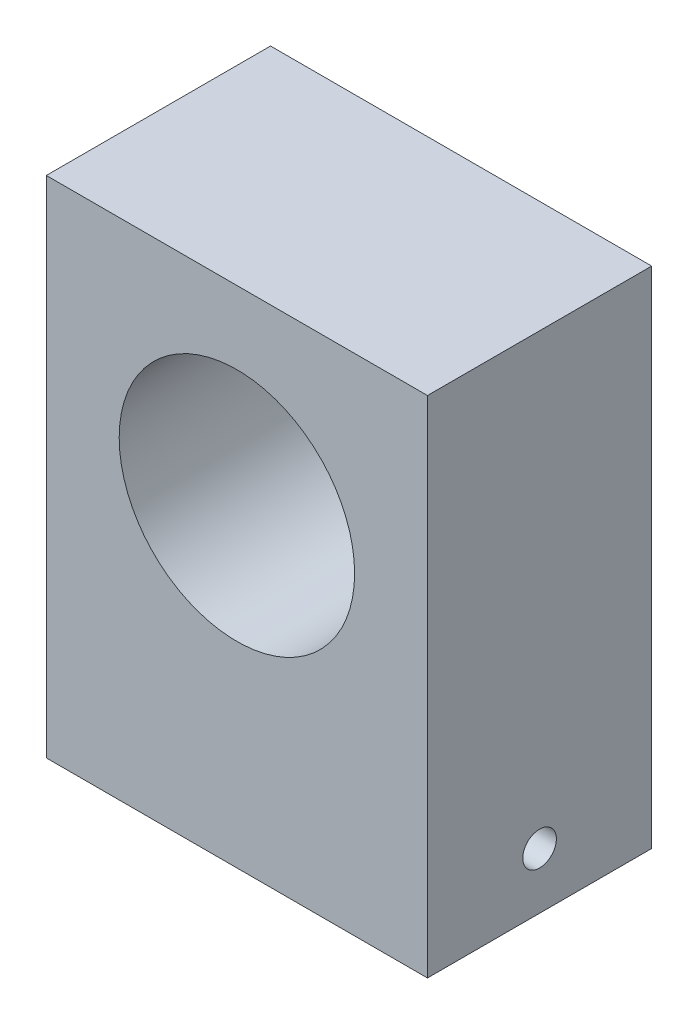
ISO-10303-21;
HEADER;
FILE_DESCRIPTION(('STEP AP214'),'2;1');
FILE_NAME('part.step','',(''),(''),'','','');
FILE_SCHEMA(('AUTOMOTIVE_DESIGN { 1 0 10303 214 1 1 1 1 }'));
ENDSEC;
DATA;
#1=APPLICATION_CONTEXT('core data for automotive mechanical design processes');
#2=APPLICATION_PROTOCOL_DEFINITION('international standard','automotive_design',2000,#1);
#3=PRODUCT_CONTEXT('',#1,'mechanical');
#4=PRODUCT('Part','Part','',(#3));
#5=PRODUCT_RELATED_PRODUCT_CATEGORY('part','',(#4));
#6=PRODUCT_DEFINITION_FORMATION('','',#4);
#7=PRODUCT_DEFINITION_CONTEXT('part definition',#1,'design');
#8=PRODUCT_DEFINITION('design','',#6,#7);
#9=PRODUCT_DEFINITION_SHAPE('','',#8);
#10=(LENGTH_UNIT() NAMED_UNIT(*) SI_UNIT(.MILLI.,.METRE.));
#11=(NAMED_UNIT(*) PLANE_ANGLE_UNIT() SI_UNIT($,.RADIAN.));
#12=(NAMED_UNIT(*) SI_UNIT($,.STERADIAN.) SOLID_ANGLE_UNIT());
#13=UNCERTAINTY_MEASURE_WITH_UNIT(LENGTH_MEASURE(1.E-05),#10,'distance_accuracy_value','');
#14=(GEOMETRIC_REPRESENTATION_CONTEXT(3) GLOBAL_UNCERTAINTY_ASSIGNED_CONTEXT((#13)) GLOBAL_UNIT_ASSIGNED_CONTEXT((#10,
#11,#12)) REPRESENTATION_CONTEXT('',''));
#15=CARTESIAN_POINT('',(0.,0.,0.));
#16=DIRECTION('',(0.,0.,1.));
#17=DIRECTION('',(1.,0.,0.));
#18=AXIS2_PLACEMENT_3D('',#15,#16,#17);
#19=CARTESIAN_POINT('',(0.,0.,-20.));
#20=DIRECTION('',(-1.,0.,0.));
#21=DIRECTION('',(0.,-1.,0.));
#22=AXIS2_PLACEMENT_3D('',#19,#20,#21);
#23=PLANE('',#22);
#24=CARTESIAN_POINT('',(0.,5.,-10.));
#25=DIRECTION('',(1.,0.,0.));
#26=DIRECTION('',(0.,1.,0.));
#27=AXIS2_PLACEMENT_3D('',#24,#25,#26);
#28=CIRCLE('',#27,1.5);
#29=CARTESIAN_POINT('',(0.,6.5,-10.));
#30=VERTEX_POINT('',#29);
#31=EDGE_CURVE('E195',#30,#30,#28,.T.);
#32=ORIENTED_EDGE('',*,*,#31,.T.);
#33=EDGE_LOOP('',(#32));
#34=FACE_BOUND('',#33,.T.);
#35=DIRECTION('',(0.,-1.,0.));
#36=VECTOR('',#35,1.);
#37=CARTESIAN_POINT('',(0.,0.,0.));
#38=LINE('',#37,#36);
#39=CARTESIAN_POINT('',(0.,45.,0.));
#40=VERTEX_POINT('',#39);
#41=CARTESIAN_POINT('',(0.,0.,0.));
#42=VERTEX_POINT('',#41);
#43=EDGE_CURVE('E134',#40,#42,#38,.T.);
#44=ORIENTED_EDGE('',*,*,#43,.F.);
#45=DIRECTION('',(0.,0.,1.));
#46=VECTOR('',#45,1.);
#47=CARTESIAN_POINT('',(0.,45.,-20.));
#48=LINE('',#47,#46);
#49=CARTESIAN_POINT('',(0.,45.,-20.));
#50=VERTEX_POINT('',#49);
#51=EDGE_CURVE('E11',#50,#40,#48,.T.);
#52=ORIENTED_EDGE('',*,*,#51,.F.);
#53=DIRECTION('',(0.,-1.,0.));
#54=VECTOR('',#53,1.);
#55=CARTESIAN_POINT('',(0.,0.,-20.));
#56=LINE('',#55,#54);
#57=CARTESIAN_POINT('',(0.,0.,-20.));
#58=VERTEX_POINT('',#57);
#59=EDGE_CURVE('E139',#50,#58,#56,.T.);
#60=ORIENTED_EDGE('',*,*,#59,.T.);
#61=DIRECTION('',(0.,0.,1.));
#62=VECTOR('',#61,1.);
#63=CARTESIAN_POINT('',(0.,0.,-20.));
#64=LINE('',#63,#62);
#65=EDGE_CURVE('E82',#58,#42,#64,.T.);
#66=ORIENTED_EDGE('',*,*,#65,.T.);
#67=EDGE_LOOP('',(#44,#52,#60,#66));
#68=FACE_BOUND('',#67,.T.);
#69=ADVANCED_FACE('F33',(#34,#68),#23,.T.);
#70=CARTESIAN_POINT('',(0.,45.,-20.));
#71=DIRECTION('',(0.,1.,0.));
#72=DIRECTION('',(0.,0.,1.));
#73=AXIS2_PLACEMENT_3D('',#70,#71,#72);
#74=PLANE('',#73);
#75=DIRECTION('',(-1.,0.,0.));
#76=VECTOR('',#75,1.);
#77=CARTESIAN_POINT('',(0.,45.,0.));
#78=LINE('',#77,#76);
#79=CARTESIAN_POINT('',(34.,45.,0.));
#80=VERTEX_POINT('',#79);
#81=EDGE_CURVE('E142',#80,#40,#78,.T.);
#82=ORIENTED_EDGE('',*,*,#81,.F.);
#83=DIRECTION('',(0.,0.,1.));
#84=VECTOR('',#83,1.);
#85=CARTESIAN_POINT('',(34.,45.,-20.));
#86=LINE('',#85,#84);
#87=CARTESIAN_POINT('',(34.,45.,-20.));
#88=VERTEX_POINT('',#87);
#89=EDGE_CURVE('E41',#88,#80,#86,.T.);
#90=ORIENTED_EDGE('',*,*,#89,.F.);
#91=DIRECTION('',(-1.,0.,0.));
#92=VECTOR('',#91,1.);
#93=CARTESIAN_POINT('',(0.,45.,-20.));
#94=LINE('',#93,#92);
#95=EDGE_CURVE('E147',#88,#50,#94,.T.);
#96=ORIENTED_EDGE('',*,*,#95,.T.);
#97=ORIENTED_EDGE('',*,*,#51,.T.);
#98=EDGE_LOOP('',(#82,#90,#96,#97));
#99=FACE_BOUND('',#98,.T.);
#100=ADVANCED_FACE('F165',(#99),#74,.T.);
#101=CARTESIAN_POINT('',(34.,0.,-20.));
#102=DIRECTION('',(1.,0.,0.));
#103=DIRECTION('',(0.,1.,0.));
#104=AXIS2_PLACEMENT_3D('',#101,#102,#103);
#105=PLANE('',#104);
#106=CARTESIAN_POINT('',(34.,5.,-10.));
#107=DIRECTION('',(1.,0.,0.));
#108=DIRECTION('',(0.,1.,0.));
#109=AXIS2_PLACEMENT_3D('',#106,#107,#108);
#110=CIRCLE('',#109,1.5);
#111=CARTESIAN_POINT('',(34.,6.5,-10.));
#112=VERTEX_POINT('',#111);
#113=EDGE_CURVE('E192',#112,#112,#110,.T.);
#114=ORIENTED_EDGE('',*,*,#113,.F.);
#115=EDGE_LOOP('',(#114));
#116=FACE_BOUND('',#115,.T.);
#117=DIRECTION('',(0.,1.,0.));
#118=VECTOR('',#117,1.);
#119=CARTESIAN_POINT('',(34.,0.,0.));
#120=LINE('',#119,#118);
#121=CARTESIAN_POINT('',(34.,0.,0.));
#122=VERTEX_POINT('',#121);
#123=EDGE_CURVE('E154',#122,#80,#120,.T.);
#124=ORIENTED_EDGE('',*,*,#123,.F.);
#125=DIRECTION('',(0.,0.,1.));
#126=VECTOR('',#125,1.);
#127=CARTESIAN_POINT('',(34.,0.,-20.));
#128=LINE('',#127,#126);
#129=CARTESIAN_POINT('',(34.,0.,-20.));
#130=VERTEX_POINT('',#129);
#131=EDGE_CURVE('E160',#130,#122,#128,.T.);
#132=ORIENTED_EDGE('',*,*,#131,.F.);
#133=DIRECTION('',(0.,1.,0.));
#134=VECTOR('',#133,1.);
#135=CARTESIAN_POINT('',(34.,0.,-20.));
#136=LINE('',#135,#134);
#137=EDGE_CURVE('E144',#130,#88,#136,.T.);
#138=ORIENTED_EDGE('',*,*,#137,.T.);
#139=ORIENTED_EDGE('',*,*,#89,.T.);
#140=EDGE_LOOP('',(#124,#132,#138,#139));
#141=FACE_BOUND('',#140,.T.);
#142=ADVANCED_FACE('F169',(#116,#141),#105,.T.);
#143=CARTESIAN_POINT('',(0.,0.,-20.));
#144=DIRECTION('',(0.,-1.,0.));
#145=DIRECTION('',(0.,0.,-1.));
#146=AXIS2_PLACEMENT_3D('',#143,#144,#145);
#147=PLANE('',#146);
#148=DIRECTION('',(0.,0.,-1.));
#149=VECTOR('',#148,1.);
#150=CARTESIAN_POINT('',(24.65,0.,-6.));
#151=LINE('',#150,#149);
#152=CARTESIAN_POINT('',(24.65,0.,-6.));
#153=VERTEX_POINT('',#152);
#154=CARTESIAN_POINT('',(24.65,0.,-20.));
#155=VERTEX_POINT('',#154);
#156=EDGE_CURVE('E138',#153,#155,#151,.T.);
#157=ORIENTED_EDGE('',*,*,#156,.T.);
#158=DIRECTION('',(1.,0.,0.));
#159=VECTOR('',#158,1.);
#160=CARTESIAN_POINT('',(0.,0.,-20.));
#161=LINE('',#160,#159);
#162=EDGE_CURVE('E141',#155,#130,#161,.T.);
#163=ORIENTED_EDGE('',*,*,#162,.T.);
#164=ORIENTED_EDGE('',*,*,#131,.T.);
#165=DIRECTION('',(1.,0.,0.));
#166=VECTOR('',#165,1.);
#167=CARTESIAN_POINT('',(0.,0.,0.));
#168=LINE('',#167,#166);
#169=EDGE_CURVE('E151',#42,#122,#168,.T.);
#170=ORIENTED_EDGE('',*,*,#169,.F.);
#171=ORIENTED_EDGE('',*,*,#65,.F.);
#172=CARTESIAN_POINT('',(9.35,0.,-20.));
#173=VERTEX_POINT('',#172);
#174=EDGE_CURVE('E124',#58,#173,#161,.T.);
#175=ORIENTED_EDGE('',*,*,#174,.T.);
#176=DIRECTION('',(0.,0.,-1.));
#177=VECTOR('',#176,1.);
#178=CARTESIAN_POINT('',(9.35,0.,-6.));
#179=LINE('',#178,#177);
#180=CARTESIAN_POINT('',(9.35,0.,-6.));
#181=VERTEX_POINT('',#180);
#182=EDGE_CURVE('E49',#181,#173,#179,.T.);
#183=ORIENTED_EDGE('',*,*,#182,.F.);
#184=DIRECTION('',(-1.,0.,0.));
#185=VECTOR('',#184,1.);
#186=CARTESIAN_POINT('',(24.65,0.,-6.));
#187=LINE('',#186,#185);
#188=EDGE_CURVE('E113',#153,#181,#187,.T.);
#189=ORIENTED_EDGE('',*,*,#188,.F.);
#190=EDGE_LOOP('',(#157,#163,#164,#170,#171,#175,#183,#189));
#191=FACE_BOUND('',#190,.T.);
#192=ADVANCED_FACE('F123',(#191),#147,.T.);
#193=CARTESIAN_POINT('',(0.,0.,-20.));
#194=DIRECTION('',(0.,0.,-1.));
#195=DIRECTION('',(-1.,0.,0.));
#196=AXIS2_PLACEMENT_3D('',#193,#194,#195);
#197=PLANE('',#196);
#198=DIRECTION('',(0.,-1.,0.));
#199=VECTOR('',#198,1.);
#200=CARTESIAN_POINT('',(24.65,12.,-20.));
#201=LINE('',#200,#199);
#202=CARTESIAN_POINT('',(24.65,12.,-20.));
#203=VERTEX_POINT('',#202);
#204=EDGE_CURVE('E121',#203,#155,#201,.T.);
#205=ORIENTED_EDGE('',*,*,#204,.F.);
#206=DIRECTION('',(-1.,0.,0.));
#207=VECTOR('',#206,1.);
#208=CARTESIAN_POINT('',(24.65,12.,-20.));
#209=LINE('',#208,#207);
#210=CARTESIAN_POINT('',(9.35,12.,-20.));
#211=VERTEX_POINT('',#210);
#212=EDGE_CURVE('E178',#203,#211,#209,.T.);
#213=ORIENTED_EDGE('',*,*,#212,.T.);
#214=DIRECTION('',(0.,-1.,0.));
#215=VECTOR('',#214,1.);
#216=CARTESIAN_POINT('',(9.35,12.,-20.));
#217=LINE('',#216,#215);
#218=EDGE_CURVE('E176',#211,#173,#217,.T.);
#219=ORIENTED_EDGE('',*,*,#218,.T.);
#220=ORIENTED_EDGE('',*,*,#174,.F.);
#221=ORIENTED_EDGE('',*,*,#59,.F.);
#222=ORIENTED_EDGE('',*,*,#95,.F.);
#223=ORIENTED_EDGE('',*,*,#137,.F.);
#224=ORIENTED_EDGE('',*,*,#162,.F.);
#225=EDGE_LOOP('',(#205,#213,#219,#220,#221,#222,#223,#224));
#226=FACE_BOUND('',#225,.T.);
#227=CARTESIAN_POINT('',(17.,28.,-20.));
#228=DIRECTION('',(0.,0.,1.));
#229=DIRECTION('',(1.,0.,0.));
#230=AXIS2_PLACEMENT_3D('',#227,#228,#229);
#231=CIRCLE('',#230,10.5);
#232=CARTESIAN_POINT('',(27.5,28.,-20.));
#233=VERTEX_POINT('',#232);
#234=EDGE_CURVE('E131',#233,#233,#231,.T.);
#235=ORIENTED_EDGE('',*,*,#234,.T.);
#236=EDGE_LOOP('',(#235));
#237=FACE_BOUND('',#236,.T.);
#238=ADVANCED_FACE('F173',(#226,#237),#197,.T.);
#239=CARTESIAN_POINT('',(0.,0.,0.));
#240=DIRECTION('',(0.,0.,-1.));
#241=DIRECTION('',(-1.,0.,0.));
#242=AXIS2_PLACEMENT_3D('',#239,#240,#241);
#243=PLANE('',#242);
#244=CARTESIAN_POINT('',(17.,28.,0.));
#245=DIRECTION('',(0.,0.,1.));
#246=DIRECTION('',(1.,0.,0.));
#247=AXIS2_PLACEMENT_3D('',#244,#245,#246);
#248=CIRCLE('',#247,10.5);
#249=CARTESIAN_POINT('',(27.5,28.,0.));
#250=VERTEX_POINT('',#249);
#251=EDGE_CURVE('E135',#250,#250,#248,.T.);
#252=ORIENTED_EDGE('',*,*,#251,.F.);
#253=EDGE_LOOP('',(#252));
#254=FACE_BOUND('',#253,.T.);
#255=ORIENTED_EDGE('',*,*,#43,.T.);
#256=ORIENTED_EDGE('',*,*,#169,.T.);
#257=ORIENTED_EDGE('',*,*,#123,.T.);
#258=ORIENTED_EDGE('',*,*,#81,.T.);
#259=EDGE_LOOP('',(#255,#256,#257,#258));
#260=FACE_BOUND('',#259,.T.);
#261=ADVANCED_FACE('F164',(#254,#260),#243,.F.);
#262=CARTESIAN_POINT('',(17.,28.,-20.));
#263=DIRECTION('',(0.,0.,1.));
#264=DIRECTION('',(1.,0.,0.));
#265=AXIS2_PLACEMENT_3D('',#262,#263,#264);
#266=CYLINDRICAL_SURFACE('',#265,10.5);
#267=ORIENTED_EDGE('',*,*,#234,.F.);
#268=EDGE_LOOP('',(#267));
#269=FACE_BOUND('',#268,.T.);
#270=ORIENTED_EDGE('',*,*,#251,.T.);
#271=EDGE_LOOP('',(#270));
#272=FACE_BOUND('',#271,.T.);
#273=ADVANCED_FACE('F233',(#269,#272),#266,.F.);
#274=CARTESIAN_POINT('',(24.65,12.,-6.));
#275=DIRECTION('',(1.,0.,0.));
#276=DIRECTION('',(0.,0.,-1.));
#277=AXIS2_PLACEMENT_3D('',#274,#275,#276);
#278=PLANE('',#277);
#279=CARTESIAN_POINT('',(24.65,5.,-10.));
#280=DIRECTION('',(1.,0.,0.));
#281=DIRECTION('',(0.,0.,-1.));
#282=AXIS2_PLACEMENT_3D('',#279,#280,#281);
#283=CIRCLE('',#282,1.5);
#284=CARTESIAN_POINT('',(24.65,5.,-11.5));
#285=VERTEX_POINT('',#284);
#286=EDGE_CURVE('E179',#285,#285,#283,.T.);
#287=ORIENTED_EDGE('',*,*,#286,.T.);
#288=EDGE_LOOP('',(#287));
#289=FACE_BOUND('',#288,.T.);
#290=ORIENTED_EDGE('',*,*,#204,.T.);
#291=ORIENTED_EDGE('',*,*,#156,.F.);
#292=DIRECTION('',(0.,-1.,0.));
#293=VECTOR('',#292,1.);
#294=CARTESIAN_POINT('',(24.65,12.,-6.));
#295=LINE('',#294,#293);
#296=CARTESIAN_POINT('',(24.65,12.,-6.));
#297=VERTEX_POINT('',#296);
#298=EDGE_CURVE('E119',#297,#153,#295,.T.);
#299=ORIENTED_EDGE('',*,*,#298,.F.);
#300=DIRECTION('',(0.,0.,-1.));
#301=VECTOR('',#300,1.);
#302=CARTESIAN_POINT('',(24.65,12.,-6.));
#303=LINE('',#302,#301);
#304=EDGE_CURVE('E126',#297,#203,#303,.T.);
#305=ORIENTED_EDGE('',*,*,#304,.T.);
#306=EDGE_LOOP('',(#290,#291,#299,#305));
#307=FACE_BOUND('',#306,.T.);
#308=ADVANCED_FACE('F188',(#289,#307),#278,.F.);
#309=CARTESIAN_POINT('',(24.65,12.,-6.));
#310=DIRECTION('',(0.,-1.,0.));
#311=DIRECTION('',(0.,0.,-1.));
#312=AXIS2_PLACEMENT_3D('',#309,#310,#311);
#313=PLANE('',#312);
#314=ORIENTED_EDGE('',*,*,#212,.F.);
#315=ORIENTED_EDGE('',*,*,#304,.F.);
#316=DIRECTION('',(-1.,0.,0.));
#317=VECTOR('',#316,1.);
#318=CARTESIAN_POINT('',(24.65,12.,-6.));
#319=LINE('',#318,#317);
#320=CARTESIAN_POINT('',(9.35,12.,-6.));
#321=VERTEX_POINT('',#320);
#322=EDGE_CURVE('E112',#297,#321,#319,.T.);
#323=ORIENTED_EDGE('',*,*,#322,.T.);
#324=DIRECTION('',(0.,0.,-1.));
#325=VECTOR('',#324,1.);
#326=CARTESIAN_POINT('',(9.35,12.,-6.));
#327=LINE('',#326,#325);
#328=EDGE_CURVE('E109',#321,#211,#327,.T.);
#329=ORIENTED_EDGE('',*,*,#328,.T.);
#330=EDGE_LOOP('',(#314,#315,#323,#329));
#331=FACE_BOUND('',#330,.T.);
#332=ADVANCED_FACE('F190',(#331),#313,.T.);
#333=CARTESIAN_POINT('',(9.35,12.,-6.));
#334=DIRECTION('',(1.,0.,0.));
#335=DIRECTION('',(0.,1.,0.));
#336=AXIS2_PLACEMENT_3D('',#333,#334,#335);
#337=PLANE('',#336);
#338=CARTESIAN_POINT('',(9.35,5.,-10.));
#339=DIRECTION('',(1.,0.,0.));
#340=DIRECTION('',(0.,1.,0.));
#341=AXIS2_PLACEMENT_3D('',#338,#339,#340);
#342=CIRCLE('',#341,1.5);
#343=CARTESIAN_POINT('',(9.35,6.5,-10.));
#344=VERTEX_POINT('',#343);
#345=EDGE_CURVE('E36',#344,#344,#342,.T.);
#346=ORIENTED_EDGE('',*,*,#345,.F.);
#347=EDGE_LOOP('',(#346));
#348=FACE_BOUND('',#347,.T.);
#349=ORIENTED_EDGE('',*,*,#218,.F.);
#350=ORIENTED_EDGE('',*,*,#328,.F.);
#351=DIRECTION('',(0.,-1.,0.));
#352=VECTOR('',#351,1.);
#353=CARTESIAN_POINT('',(9.35,12.,-6.));
#354=LINE('',#353,#352);
#355=EDGE_CURVE('E106',#321,#181,#354,.T.);
#356=ORIENTED_EDGE('',*,*,#355,.T.);
#357=ORIENTED_EDGE('',*,*,#182,.T.);
#358=EDGE_LOOP('',(#349,#350,#356,#357));
#359=FACE_BOUND('',#358,.T.);
#360=ADVANCED_FACE('F108',(#348,#359),#337,.T.);
#361=CARTESIAN_POINT('',(0.,0.,-6.));
#362=DIRECTION('',(0.,0.,1.));
#363=DIRECTION('',(1.,0.,0.));
#364=AXIS2_PLACEMENT_3D('',#361,#362,#363);
#365=PLANE('',#364);
#366=ORIENTED_EDGE('',*,*,#188,.T.);
#367=ORIENTED_EDGE('',*,*,#355,.F.);
#368=ORIENTED_EDGE('',*,*,#322,.F.);
#369=ORIENTED_EDGE('',*,*,#298,.T.);
#370=EDGE_LOOP('',(#366,#367,#368,#369));
#371=FACE_BOUND('',#370,.T.);
#372=ADVANCED_FACE('F117',(#371),#365,.F.);
#373=CARTESIAN_POINT('',(0.,5.,-10.));
#374=DIRECTION('',(1.,0.,0.));
#375=DIRECTION('',(0.,1.,0.));
#376=AXIS2_PLACEMENT_3D('',#373,#374,#375);
#377=CYLINDRICAL_SURFACE('',#376,1.5);
#378=ORIENTED_EDGE('',*,*,#345,.T.);
#379=EDGE_LOOP('',(#378));
#380=FACE_BOUND('',#379,.T.);
#381=ORIENTED_EDGE('',*,*,#31,.F.);
#382=EDGE_LOOP('',(#381));
#383=FACE_BOUND('',#382,.T.);
#384=ADVANCED_FACE('F202',(#380,#383),#377,.F.);
#385=ORIENTED_EDGE('',*,*,#113,.T.);
#386=EDGE_LOOP('',(#385));
#387=FACE_BOUND('',#386,.T.);
#388=ORIENTED_EDGE('',*,*,#286,.F.);
#389=EDGE_LOOP('',(#388));
#390=FACE_BOUND('',#389,.T.);
#391=ADVANCED_FACE('F249',(#387,#390),#377,.F.);
#392=CLOSED_SHELL('',(#69,#100,#142,#192,#238,#261,#273,#308,#332,#360,#372,#384,#391));
#393=MANIFOLD_SOLID_BREP('B2',#392);
#394=ADVANCED_BREP_SHAPE_REPRESENTATION('',(#18,#393),#14);
#395=SHAPE_DEFINITION_REPRESENTATION(#9,#394);
ENDSEC;
END-ISO-10303-21;
